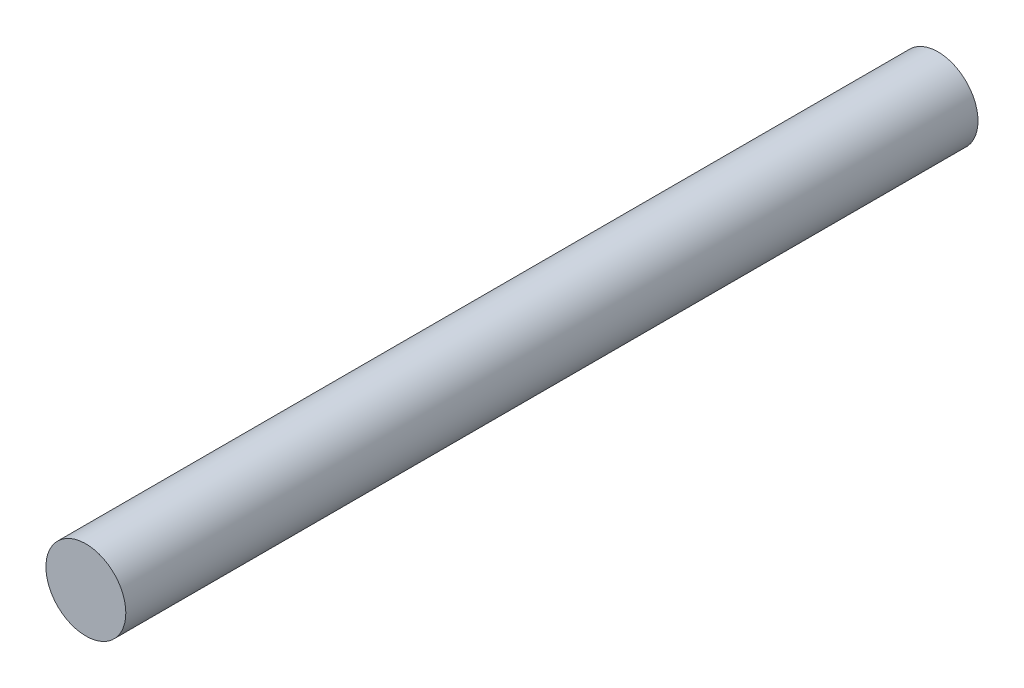
ISO-10303-21;
HEADER;
FILE_DESCRIPTION(('STEP AP214'),'2;1');
FILE_NAME('part.step','',(''),(''),'','','');
FILE_SCHEMA(('AUTOMOTIVE_DESIGN { 1 0 10303 214 1 1 1 1 }'));
ENDSEC;
DATA;
#1=APPLICATION_CONTEXT('core data for automotive mechanical design processes');
#2=APPLICATION_PROTOCOL_DEFINITION('international standard','automotive_design',2000,#1);
#3=PRODUCT_CONTEXT('',#1,'mechanical');
#4=PRODUCT('Part','Part','',(#3));
#5=PRODUCT_RELATED_PRODUCT_CATEGORY('part','',(#4));
#6=PRODUCT_DEFINITION_FORMATION('','',#4);
#7=PRODUCT_DEFINITION_CONTEXT('part definition',#1,'design');
#8=PRODUCT_DEFINITION('design','',#6,#7);
#9=PRODUCT_DEFINITION_SHAPE('','',#8);
#10=(LENGTH_UNIT() NAMED_UNIT(*) SI_UNIT(.MILLI.,.METRE.));
#11=(NAMED_UNIT(*) PLANE_ANGLE_UNIT() SI_UNIT($,.RADIAN.));
#12=(NAMED_UNIT(*) SI_UNIT($,.STERADIAN.) SOLID_ANGLE_UNIT());
#13=UNCERTAINTY_MEASURE_WITH_UNIT(LENGTH_MEASURE(1.E-05),#10,'distance_accuracy_value','');
#14=(GEOMETRIC_REPRESENTATION_CONTEXT(3) GLOBAL_UNCERTAINTY_ASSIGNED_CONTEXT((#13)) GLOBAL_UNIT_ASSIGNED_CONTEXT((#10,
#11,#12)) REPRESENTATION_CONTEXT('',''));
#15=CARTESIAN_POINT('',(0.,0.,0.));
#16=DIRECTION('',(0.,0.,1.));
#17=DIRECTION('',(1.,0.,0.));
#18=AXIS2_PLACEMENT_3D('',#15,#16,#17);
#19=CARTESIAN_POINT('',(0.,0.,101.6));
#20=DIRECTION('',(0.,0.,-1.));
#21=DIRECTION('',(-1.,0.,0.));
#22=AXIS2_PLACEMENT_3D('',#19,#20,#21);
#23=CYLINDRICAL_SURFACE('',#22,9.525);
#24=CARTESIAN_POINT('',(0.,0.,101.6));
#25=DIRECTION('',(0.,0.,1.));
#26=DIRECTION('',(1.,0.,0.));
#27=AXIS2_PLACEMENT_3D('',#24,#25,#26);
#28=CIRCLE('',#27,9.525);
#29=CARTESIAN_POINT('',(9.525,0.,101.6));
#30=VERTEX_POINT('',#29);
#31=EDGE_CURVE('E10',#30,#30,#28,.T.);
#32=ORIENTED_EDGE('',*,*,#31,.F.);
#33=EDGE_LOOP('',(#32));
#34=FACE_BOUND('',#33,.T.);
#35=CARTESIAN_POINT('',(0.,0.,-101.6));
#36=DIRECTION('',(0.,0.,1.));
#37=DIRECTION('',(1.,0.,0.));
#38=AXIS2_PLACEMENT_3D('',#35,#36,#37);
#39=CIRCLE('',#38,9.525);
#40=CARTESIAN_POINT('',(9.525,0.,-101.6));
#41=VERTEX_POINT('',#40);
#42=EDGE_CURVE('E34',#41,#41,#39,.T.);
#43=ORIENTED_EDGE('',*,*,#42,.T.);
#44=EDGE_LOOP('',(#43));
#45=FACE_BOUND('',#44,.T.);
#46=ADVANCED_FACE('F31',(#34,#45),#23,.T.);
#47=CARTESIAN_POINT('',(0.,0.,101.6));
#48=DIRECTION('',(0.,0.,1.));
#49=DIRECTION('',(1.,0.,0.));
#50=AXIS2_PLACEMENT_3D('',#47,#48,#49);
#51=PLANE('',#50);
#52=ORIENTED_EDGE('',*,*,#31,.T.);
#53=EDGE_LOOP('',(#52));
#54=FACE_BOUND('',#53,.T.);
#55=ADVANCED_FACE('F46',(#54),#51,.T.);
#56=CARTESIAN_POINT('',(0.,0.,-101.6));
#57=DIRECTION('',(0.,0.,1.));
#58=DIRECTION('',(1.,0.,0.));
#59=AXIS2_PLACEMENT_3D('',#56,#57,#58);
#60=PLANE('',#59);
#61=ORIENTED_EDGE('',*,*,#42,.F.);
#62=EDGE_LOOP('',(#61));
#63=FACE_BOUND('',#62,.T.);
#64=ADVANCED_FACE('F44',(#63),#60,.F.);
#65=CLOSED_SHELL('',(#46,#55,#64));
#66=MANIFOLD_SOLID_BREP('B2',#65);
#67=ADVANCED_BREP_SHAPE_REPRESENTATION('',(#18,#66),#14);
#68=SHAPE_DEFINITION_REPRESENTATION(#9,#67);
ENDSEC;
END-ISO-10303-21;
